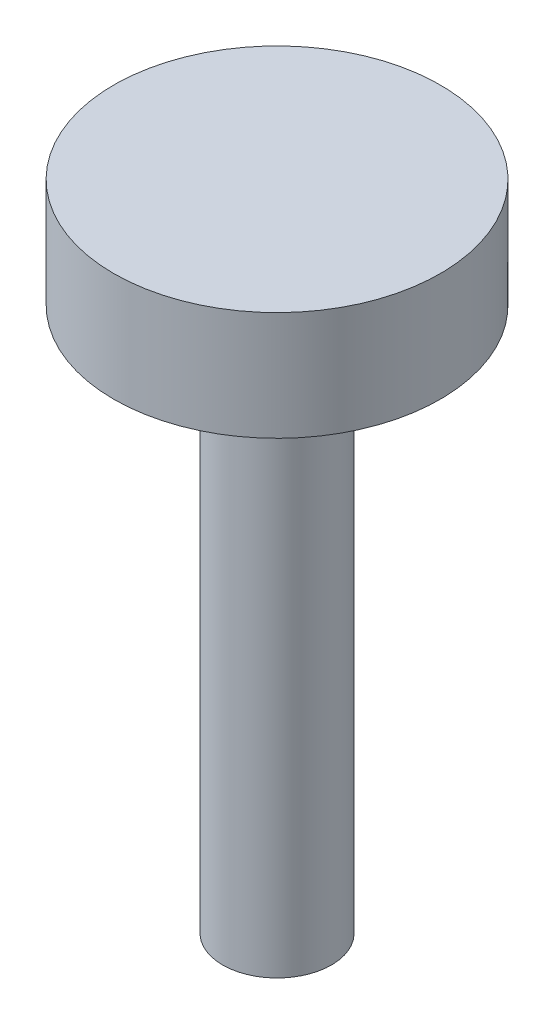
ISO-10303-21;
HEADER;
FILE_DESCRIPTION(('STEP AP214'),'2;1');
FILE_NAME('part.step','',(''),(''),'','','');
FILE_SCHEMA(('AUTOMOTIVE_DESIGN { 1 0 10303 214 1 1 1 1 }'));
ENDSEC;
DATA;
#1=APPLICATION_CONTEXT('core data for automotive mechanical design processes');
#2=APPLICATION_PROTOCOL_DEFINITION('international standard','automotive_design',2000,#1);
#3=PRODUCT_CONTEXT('',#1,'mechanical');
#4=PRODUCT('Part','Part','',(#3));
#5=PRODUCT_RELATED_PRODUCT_CATEGORY('part','',(#4));
#6=PRODUCT_DEFINITION_FORMATION('','',#4);
#7=PRODUCT_DEFINITION_CONTEXT('part definition',#1,'design');
#8=PRODUCT_DEFINITION('design','',#6,#7);
#9=PRODUCT_DEFINITION_SHAPE('','',#8);
#10=(LENGTH_UNIT() NAMED_UNIT(*) SI_UNIT(.MILLI.,.METRE.));
#11=(NAMED_UNIT(*) PLANE_ANGLE_UNIT() SI_UNIT($,.RADIAN.));
#12=(NAMED_UNIT(*) SI_UNIT($,.STERADIAN.) SOLID_ANGLE_UNIT());
#13=UNCERTAINTY_MEASURE_WITH_UNIT(LENGTH_MEASURE(1.E-05),#10,'distance_accuracy_value','');
#14=(GEOMETRIC_REPRESENTATION_CONTEXT(3) GLOBAL_UNCERTAINTY_ASSIGNED_CONTEXT((#13)) GLOBAL_UNIT_ASSIGNED_CONTEXT((#10,
#11,#12)) REPRESENTATION_CONTEXT('',''));
#15=CARTESIAN_POINT('',(0.,0.,0.));
#16=DIRECTION('',(0.,0.,1.));
#17=DIRECTION('',(1.,0.,0.));
#18=AXIS2_PLACEMENT_3D('',#15,#16,#17);
#19=CARTESIAN_POINT('',(0.,25.,0.));
#20=DIRECTION('',(0.,-1.,0.));
#21=DIRECTION('',(0.,0.,-1.));
#22=AXIS2_PLACEMENT_3D('',#19,#20,#21);
#23=CYLINDRICAL_SURFACE('',#22,2.5);
#24=CARTESIAN_POINT('',(0.,25.,0.));
#25=DIRECTION('',(0.,1.,0.));
#26=DIRECTION('',(0.,0.,1.));
#27=AXIS2_PLACEMENT_3D('',#24,#25,#26);
#28=CIRCLE('',#27,2.5);
#29=CARTESIAN_POINT('',(0.,25.,2.5));
#30=VERTEX_POINT('',#29);
#31=EDGE_CURVE('E10',#30,#30,#28,.T.);
#32=ORIENTED_EDGE('',*,*,#31,.F.);
#33=EDGE_LOOP('',(#32));
#34=FACE_BOUND('',#33,.T.);
#35=CARTESIAN_POINT('',(0.,0.,0.));
#36=DIRECTION('',(0.,1.,0.));
#37=DIRECTION('',(0.,0.,1.));
#38=AXIS2_PLACEMENT_3D('',#35,#36,#37);
#39=CIRCLE('',#38,2.5);
#40=CARTESIAN_POINT('',(0.,0.,2.5));
#41=VERTEX_POINT('',#40);
#42=EDGE_CURVE('E46',#41,#41,#39,.T.);
#43=ORIENTED_EDGE('',*,*,#42,.T.);
#44=EDGE_LOOP('',(#43));
#45=FACE_BOUND('',#44,.T.);
#46=ADVANCED_FACE('F43',(#34,#45),#23,.T.);
#47=CARTESIAN_POINT('',(0.,0.,0.));
#48=DIRECTION('',(0.,1.,0.));
#49=DIRECTION('',(0.,0.,1.));
#50=AXIS2_PLACEMENT_3D('',#47,#48,#49);
#51=PLANE('',#50);
#52=ORIENTED_EDGE('',*,*,#42,.F.);
#53=EDGE_LOOP('',(#52));
#54=FACE_BOUND('',#53,.T.);
#55=ADVANCED_FACE('F70',(#54),#51,.F.);
#56=CARTESIAN_POINT('',(0.,30.,0.));
#57=DIRECTION('',(0.,-1.,0.));
#58=DIRECTION('',(0.,0.,-1.));
#59=AXIS2_PLACEMENT_3D('',#56,#57,#58);
#60=CYLINDRICAL_SURFACE('',#59,7.5);
#61=CARTESIAN_POINT('',(0.,30.,0.));
#62=DIRECTION('',(0.,1.,0.));
#63=DIRECTION('',(0.,0.,1.));
#64=AXIS2_PLACEMENT_3D('',#61,#62,#63);
#65=CIRCLE('',#64,7.5);
#66=CARTESIAN_POINT('',(0.,30.,7.5));
#67=VERTEX_POINT('',#66);
#68=EDGE_CURVE('E55',#67,#67,#65,.T.);
#69=ORIENTED_EDGE('',*,*,#68,.F.);
#70=EDGE_LOOP('',(#69));
#71=FACE_BOUND('',#70,.T.);
#72=CARTESIAN_POINT('',(0.,25.,0.));
#73=DIRECTION('',(0.,1.,0.));
#74=DIRECTION('',(0.,0.,1.));
#75=AXIS2_PLACEMENT_3D('',#72,#73,#74);
#76=CIRCLE('',#75,7.5);
#77=CARTESIAN_POINT('',(0.,25.,7.5));
#78=VERTEX_POINT('',#77);
#79=EDGE_CURVE('E57',#78,#78,#76,.T.);
#80=ORIENTED_EDGE('',*,*,#79,.T.);
#81=EDGE_LOOP('',(#80));
#82=FACE_BOUND('',#81,.T.);
#83=ADVANCED_FACE('F67',(#71,#82),#60,.T.);
#84=CARTESIAN_POINT('',(0.,30.,0.));
#85=DIRECTION('',(0.,1.,0.));
#86=DIRECTION('',(0.,0.,1.));
#87=AXIS2_PLACEMENT_3D('',#84,#85,#86);
#88=PLANE('',#87);
#89=ORIENTED_EDGE('',*,*,#68,.T.);
#90=EDGE_LOOP('',(#89));
#91=FACE_BOUND('',#90,.T.);
#92=ADVANCED_FACE('F65',(#91),#88,.T.);
#93=CARTESIAN_POINT('',(0.,25.,0.));
#94=DIRECTION('',(0.,1.,0.));
#95=DIRECTION('',(0.,0.,1.));
#96=AXIS2_PLACEMENT_3D('',#93,#94,#95);
#97=PLANE('',#96);
#98=ORIENTED_EDGE('',*,*,#31,.T.);
#99=EDGE_LOOP('',(#98));
#100=FACE_BOUND('',#99,.T.);
#101=ORIENTED_EDGE('',*,*,#79,.F.);
#102=EDGE_LOOP('',(#101));
#103=FACE_BOUND('',#102,.T.);
#104=ADVANCED_FACE('F74',(#100,#103),#97,.F.);
#105=CLOSED_SHELL('',(#46,#55,#83,#92,#104));
#106=MANIFOLD_SOLID_BREP('B2',#105);
#107=ADVANCED_BREP_SHAPE_REPRESENTATION('',(#18,#106),#14);
#108=SHAPE_DEFINITION_REPRESENTATION(#9,#107);
ENDSEC;
END-ISO-10303-21;
